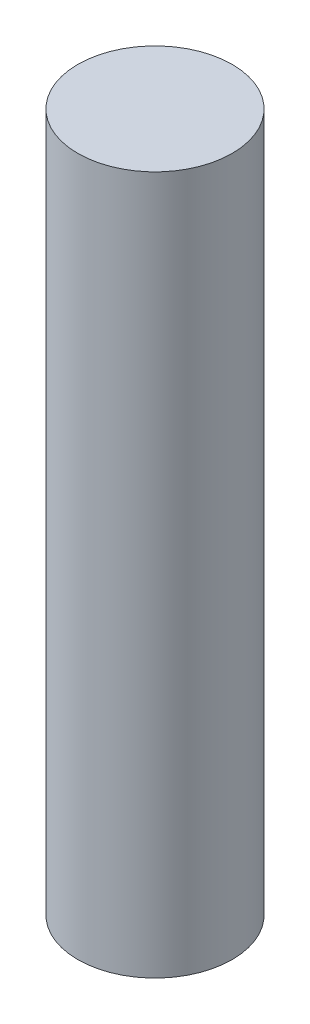
ISO-10303-21;
HEADER;
FILE_DESCRIPTION(('STEP AP214'),'2;1');
FILE_NAME('part.step','',(''),(''),'','','');
FILE_SCHEMA(('AUTOMOTIVE_DESIGN { 1 0 10303 214 1 1 1 1 }'));
ENDSEC;
DATA;
#1=APPLICATION_CONTEXT('core data for automotive mechanical design processes');
#2=APPLICATION_PROTOCOL_DEFINITION('international standard','automotive_design',2000,#1);
#3=PRODUCT_CONTEXT('',#1,'mechanical');
#4=PRODUCT('Part','Part','',(#3));
#5=PRODUCT_RELATED_PRODUCT_CATEGORY('part','',(#4));
#6=PRODUCT_DEFINITION_FORMATION('','',#4);
#7=PRODUCT_DEFINITION_CONTEXT('part definition',#1,'design');
#8=PRODUCT_DEFINITION('design','',#6,#7);
#9=PRODUCT_DEFINITION_SHAPE('','',#8);
#10=(LENGTH_UNIT() NAMED_UNIT(*) SI_UNIT(.MILLI.,.METRE.));
#11=(NAMED_UNIT(*) PLANE_ANGLE_UNIT() SI_UNIT($,.RADIAN.));
#12=(NAMED_UNIT(*) SI_UNIT($,.STERADIAN.) SOLID_ANGLE_UNIT());
#13=UNCERTAINTY_MEASURE_WITH_UNIT(LENGTH_MEASURE(1.E-05),#10,'distance_accuracy_value','');
#14=(GEOMETRIC_REPRESENTATION_CONTEXT(3) GLOBAL_UNCERTAINTY_ASSIGNED_CONTEXT((#13)) GLOBAL_UNIT_ASSIGNED_CONTEXT((#10,
#11,#12)) REPRESENTATION_CONTEXT('',''));
#15=CARTESIAN_POINT('',(0.,0.,0.));
#16=DIRECTION('',(0.,0.,1.));
#17=DIRECTION('',(1.,0.,0.));
#18=AXIS2_PLACEMENT_3D('',#15,#16,#17);
#19=CARTESIAN_POINT('',(0.,181.,0.));
#20=DIRECTION('',(0.,-1.,0.));
#21=DIRECTION('',(0.,0.,-1.));
#22=AXIS2_PLACEMENT_3D('',#19,#20,#21);
#23=CYLINDRICAL_SURFACE('',#22,20.);
#24=CARTESIAN_POINT('',(0.,181.,0.));
#25=DIRECTION('',(0.,1.,0.));
#26=DIRECTION('',(0.,0.,1.));
#27=AXIS2_PLACEMENT_3D('',#24,#25,#26);
#28=CIRCLE('',#27,20.);
#29=CARTESIAN_POINT('',(0.,181.,20.));
#30=VERTEX_POINT('',#29);
#31=EDGE_CURVE('E10',#30,#30,#28,.T.);
#32=ORIENTED_EDGE('',*,*,#31,.F.);
#33=EDGE_LOOP('',(#32));
#34=FACE_BOUND('',#33,.T.);
#35=CARTESIAN_POINT('',(0.,0.,0.));
#36=DIRECTION('',(0.,1.,0.));
#37=DIRECTION('',(0.,0.,1.));
#38=AXIS2_PLACEMENT_3D('',#35,#36,#37);
#39=CIRCLE('',#38,20.);
#40=CARTESIAN_POINT('',(0.,0.,20.));
#41=VERTEX_POINT('',#40);
#42=EDGE_CURVE('E46',#41,#41,#39,.T.);
#43=ORIENTED_EDGE('',*,*,#42,.T.);
#44=EDGE_LOOP('',(#43));
#45=FACE_BOUND('',#44,.T.);
#46=ADVANCED_FACE('F43',(#34,#45),#23,.T.);
#47=CARTESIAN_POINT('',(0.,181.,0.));
#48=DIRECTION('',(0.,1.,0.));
#49=DIRECTION('',(0.,0.,1.));
#50=AXIS2_PLACEMENT_3D('',#47,#48,#49);
#51=PLANE('',#50);
#52=ORIENTED_EDGE('',*,*,#31,.T.);
#53=EDGE_LOOP('',(#52));
#54=FACE_BOUND('',#53,.T.);
#55=ADVANCED_FACE('F60',(#54),#51,.T.);
#56=CARTESIAN_POINT('',(0.,0.,0.));
#57=DIRECTION('',(0.,1.,0.));
#58=DIRECTION('',(0.,0.,1.));
#59=AXIS2_PLACEMENT_3D('',#56,#57,#58);
#60=PLANE('',#59);
#61=ORIENTED_EDGE('',*,*,#42,.F.);
#62=EDGE_LOOP('',(#61));
#63=FACE_BOUND('',#62,.T.);
#64=ADVANCED_FACE('F58',(#63),#60,.F.);
#65=CLOSED_SHELL('',(#46,#55,#64));
#66=MANIFOLD_SOLID_BREP('B2',#65);
#67=ADVANCED_BREP_SHAPE_REPRESENTATION('',(#18,#66),#14);
#68=SHAPE_DEFINITION_REPRESENTATION(#9,#67);
ENDSEC;
END-ISO-10303-21;
